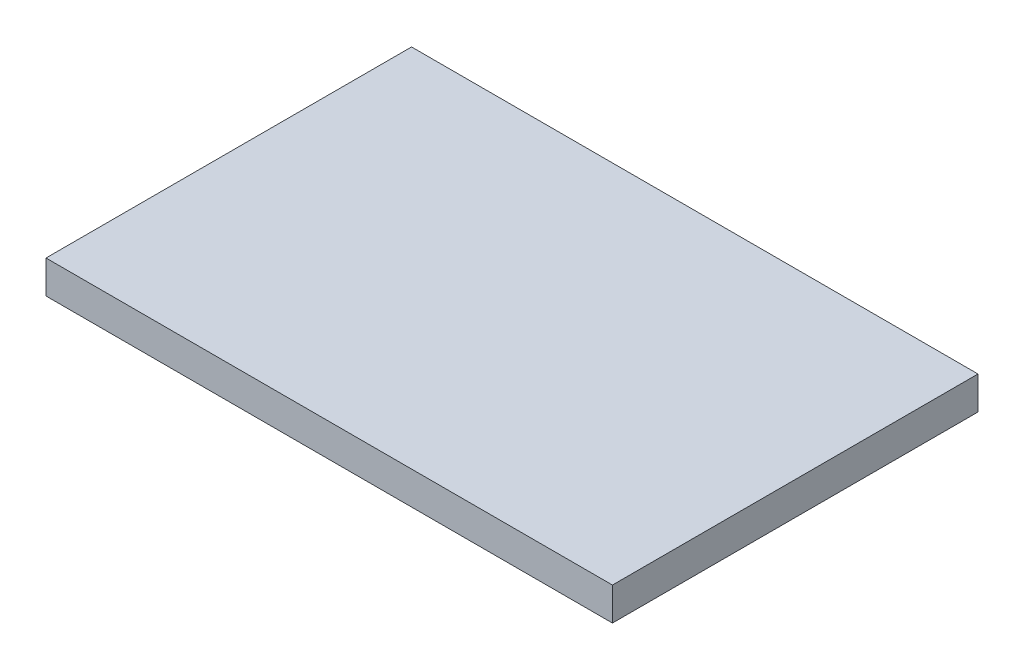
ISO-10303-21;
HEADER;
FILE_DESCRIPTION(('STEP AP214'),'2;1');
FILE_NAME('part.step','',(''),(''),'','','');
FILE_SCHEMA(('AUTOMOTIVE_DESIGN { 1 0 10303 214 1 1 1 1 }'));
ENDSEC;
DATA;
#1=APPLICATION_CONTEXT('core data for automotive mechanical design processes');
#2=APPLICATION_PROTOCOL_DEFINITION('international standard','automotive_design',2000,#1);
#3=PRODUCT_CONTEXT('',#1,'mechanical');
#4=PRODUCT('Part','Part','',(#3));
#5=PRODUCT_RELATED_PRODUCT_CATEGORY('part','',(#4));
#6=PRODUCT_DEFINITION_FORMATION('','',#4);
#7=PRODUCT_DEFINITION_CONTEXT('part definition',#1,'design');
#8=PRODUCT_DEFINITION('design','',#6,#7);
#9=PRODUCT_DEFINITION_SHAPE('','',#8);
#10=(LENGTH_UNIT() NAMED_UNIT(*) SI_UNIT(.MILLI.,.METRE.));
#11=(NAMED_UNIT(*) PLANE_ANGLE_UNIT() SI_UNIT($,.RADIAN.));
#12=(NAMED_UNIT(*) SI_UNIT($,.STERADIAN.) SOLID_ANGLE_UNIT());
#13=UNCERTAINTY_MEASURE_WITH_UNIT(LENGTH_MEASURE(1.E-05),#10,'distance_accuracy_value','');
#14=(GEOMETRIC_REPRESENTATION_CONTEXT(3) GLOBAL_UNCERTAINTY_ASSIGNED_CONTEXT((#13)) GLOBAL_UNIT_ASSIGNED_CONTEXT((#10,
#11,#12)) REPRESENTATION_CONTEXT('',''));
#15=CARTESIAN_POINT('',(0.,0.,0.));
#16=DIRECTION('',(0.,0.,1.));
#17=DIRECTION('',(1.,0.,0.));
#18=AXIS2_PLACEMENT_3D('',#15,#16,#17);
#19=CARTESIAN_POINT('',(0.,1.,0.));
#20=DIRECTION('',(1.,0.,0.));
#21=DIRECTION('',(0.,0.,-1.));
#22=AXIS2_PLACEMENT_3D('',#19,#20,#21);
#23=PLANE('',#22);
#24=DIRECTION('',(0.,0.,1.));
#25=VECTOR('',#24,1.);
#26=CARTESIAN_POINT('',(0.,0.,0.));
#27=LINE('',#26,#25);
#28=CARTESIAN_POINT('',(0.,0.,0.));
#29=VERTEX_POINT('',#28);
#30=CARTESIAN_POINT('',(0.,0.,11.1));
#31=VERTEX_POINT('',#30);
#32=EDGE_CURVE('E96',#29,#31,#27,.T.);
#33=ORIENTED_EDGE('',*,*,#32,.T.);
#34=DIRECTION('',(0.,-1.,0.));
#35=VECTOR('',#34,1.);
#36=CARTESIAN_POINT('',(0.,1.,11.1));
#37=LINE('',#36,#35);
#38=CARTESIAN_POINT('',(0.,1.,11.1));
#39=VERTEX_POINT('',#38);
#40=EDGE_CURVE('E11',#39,#31,#37,.T.);
#41=ORIENTED_EDGE('',*,*,#40,.F.);
#42=DIRECTION('',(0.,0.,1.));
#43=VECTOR('',#42,1.);
#44=CARTESIAN_POINT('',(0.,1.,0.));
#45=LINE('',#44,#43);
#46=CARTESIAN_POINT('',(0.,1.,0.));
#47=VERTEX_POINT('',#46);
#48=EDGE_CURVE('E84',#47,#39,#45,.T.);
#49=ORIENTED_EDGE('',*,*,#48,.F.);
#50=DIRECTION('',(0.,-1.,0.));
#51=VECTOR('',#50,1.);
#52=CARTESIAN_POINT('',(0.,1.,0.));
#53=LINE('',#52,#51);
#54=EDGE_CURVE('E92',#47,#29,#53,.T.);
#55=ORIENTED_EDGE('',*,*,#54,.T.);
#56=EDGE_LOOP('',(#33,#41,#49,#55));
#57=FACE_BOUND('',#56,.T.);
#58=ADVANCED_FACE('F33',(#57),#23,.F.);
#59=CARTESIAN_POINT('',(0.,1.,11.1));
#60=DIRECTION('',(0.,0.,-1.));
#61=DIRECTION('',(-1.,0.,0.));
#62=AXIS2_PLACEMENT_3D('',#59,#60,#61);
#63=PLANE('',#62);
#64=DIRECTION('',(1.,0.,0.));
#65=VECTOR('',#64,1.);
#66=CARTESIAN_POINT('',(0.,0.,11.1));
#67=LINE('',#66,#65);
#68=CARTESIAN_POINT('',(17.2,0.,11.1));
#69=VERTEX_POINT('',#68);
#70=EDGE_CURVE('E88',#31,#69,#67,.T.);
#71=ORIENTED_EDGE('',*,*,#70,.T.);
#72=DIRECTION('',(0.,-1.,0.));
#73=VECTOR('',#72,1.);
#74=CARTESIAN_POINT('',(17.2,1.,11.1));
#75=LINE('',#74,#73);
#76=CARTESIAN_POINT('',(17.2,1.,11.1));
#77=VERTEX_POINT('',#76);
#78=EDGE_CURVE('E41',#77,#69,#75,.T.);
#79=ORIENTED_EDGE('',*,*,#78,.F.);
#80=DIRECTION('',(1.,0.,0.));
#81=VECTOR('',#80,1.);
#82=CARTESIAN_POINT('',(0.,1.,11.1));
#83=LINE('',#82,#81);
#84=EDGE_CURVE('E79',#39,#77,#83,.T.);
#85=ORIENTED_EDGE('',*,*,#84,.F.);
#86=ORIENTED_EDGE('',*,*,#40,.T.);
#87=EDGE_LOOP('',(#71,#79,#85,#86));
#88=FACE_BOUND('',#87,.T.);
#89=ADVANCED_FACE('F87',(#88),#63,.F.);
#90=CARTESIAN_POINT('',(17.2,1.,0.));
#91=DIRECTION('',(-1.,0.,0.));
#92=DIRECTION('',(0.,0.,1.));
#93=AXIS2_PLACEMENT_3D('',#90,#91,#92);
#94=PLANE('',#93);
#95=DIRECTION('',(0.,0.,-1.));
#96=VECTOR('',#95,1.);
#97=CARTESIAN_POINT('',(17.2,0.,0.));
#98=LINE('',#97,#96);
#99=CARTESIAN_POINT('',(17.2,0.,0.));
#100=VERTEX_POINT('',#99);
#101=EDGE_CURVE('E66',#69,#100,#98,.T.);
#102=ORIENTED_EDGE('',*,*,#101,.T.);
#103=DIRECTION('',(0.,-1.,0.));
#104=VECTOR('',#103,1.);
#105=CARTESIAN_POINT('',(17.2,1.,0.));
#106=LINE('',#105,#104);
#107=CARTESIAN_POINT('',(17.2,1.,0.));
#108=VERTEX_POINT('',#107);
#109=EDGE_CURVE('E89',#108,#100,#106,.T.);
#110=ORIENTED_EDGE('',*,*,#109,.F.);
#111=DIRECTION('',(0.,0.,-1.));
#112=VECTOR('',#111,1.);
#113=CARTESIAN_POINT('',(17.2,1.,0.));
#114=LINE('',#113,#112);
#115=EDGE_CURVE('E82',#77,#108,#114,.T.);
#116=ORIENTED_EDGE('',*,*,#115,.F.);
#117=ORIENTED_EDGE('',*,*,#78,.T.);
#118=EDGE_LOOP('',(#102,#110,#116,#117));
#119=FACE_BOUND('',#118,.T.);
#120=ADVANCED_FACE('F90',(#119),#94,.F.);
#121=CARTESIAN_POINT('',(0.,1.,0.));
#122=DIRECTION('',(0.,0.,1.));
#123=DIRECTION('',(1.,0.,0.));
#124=AXIS2_PLACEMENT_3D('',#121,#122,#123);
#125=PLANE('',#124);
#126=DIRECTION('',(-1.,0.,0.));
#127=VECTOR('',#126,1.);
#128=CARTESIAN_POINT('',(0.,0.,0.));
#129=LINE('',#128,#127);
#130=EDGE_CURVE('E72',#100,#29,#129,.T.);
#131=ORIENTED_EDGE('',*,*,#130,.T.);
#132=ORIENTED_EDGE('',*,*,#54,.F.);
#133=DIRECTION('',(-1.,0.,0.));
#134=VECTOR('',#133,1.);
#135=CARTESIAN_POINT('',(0.,1.,0.));
#136=LINE('',#135,#134);
#137=EDGE_CURVE('E49',#108,#47,#136,.T.);
#138=ORIENTED_EDGE('',*,*,#137,.F.);
#139=ORIENTED_EDGE('',*,*,#109,.T.);
#140=EDGE_LOOP('',(#131,#132,#138,#139));
#141=FACE_BOUND('',#140,.T.);
#142=ADVANCED_FACE('F103',(#141),#125,.F.);
#143=CARTESIAN_POINT('',(0.,1.,0.));
#144=DIRECTION('',(0.,1.,0.));
#145=DIRECTION('',(0.,0.,1.));
#146=AXIS2_PLACEMENT_3D('',#143,#144,#145);
#147=PLANE('',#146);
#148=ORIENTED_EDGE('',*,*,#48,.T.);
#149=ORIENTED_EDGE('',*,*,#84,.T.);
#150=ORIENTED_EDGE('',*,*,#115,.T.);
#151=ORIENTED_EDGE('',*,*,#137,.T.);
#152=EDGE_LOOP('',(#148,#149,#150,#151));
#153=FACE_BOUND('',#152,.T.);
#154=ADVANCED_FACE('F80',(#153),#147,.T.);
#155=CARTESIAN_POINT('',(0.,0.,0.));
#156=DIRECTION('',(0.,1.,0.));
#157=DIRECTION('',(0.,0.,1.));
#158=AXIS2_PLACEMENT_3D('',#155,#156,#157);
#159=PLANE('',#158);
#160=ORIENTED_EDGE('',*,*,#32,.F.);
#161=ORIENTED_EDGE('',*,*,#130,.F.);
#162=ORIENTED_EDGE('',*,*,#101,.F.);
#163=ORIENTED_EDGE('',*,*,#70,.F.);
#164=EDGE_LOOP('',(#160,#161,#162,#163));
#165=FACE_BOUND('',#164,.T.);
#166=ADVANCED_FACE('F106',(#165),#159,.F.);
#167=CLOSED_SHELL('',(#58,#89,#120,#142,#154,#166));
#168=MANIFOLD_SOLID_BREP('B2',#167);
#169=ADVANCED_BREP_SHAPE_REPRESENTATION('',(#18,#168),#14);
#170=SHAPE_DEFINITION_REPRESENTATION(#9,#169);
ENDSEC;
END-ISO-10303-21;
